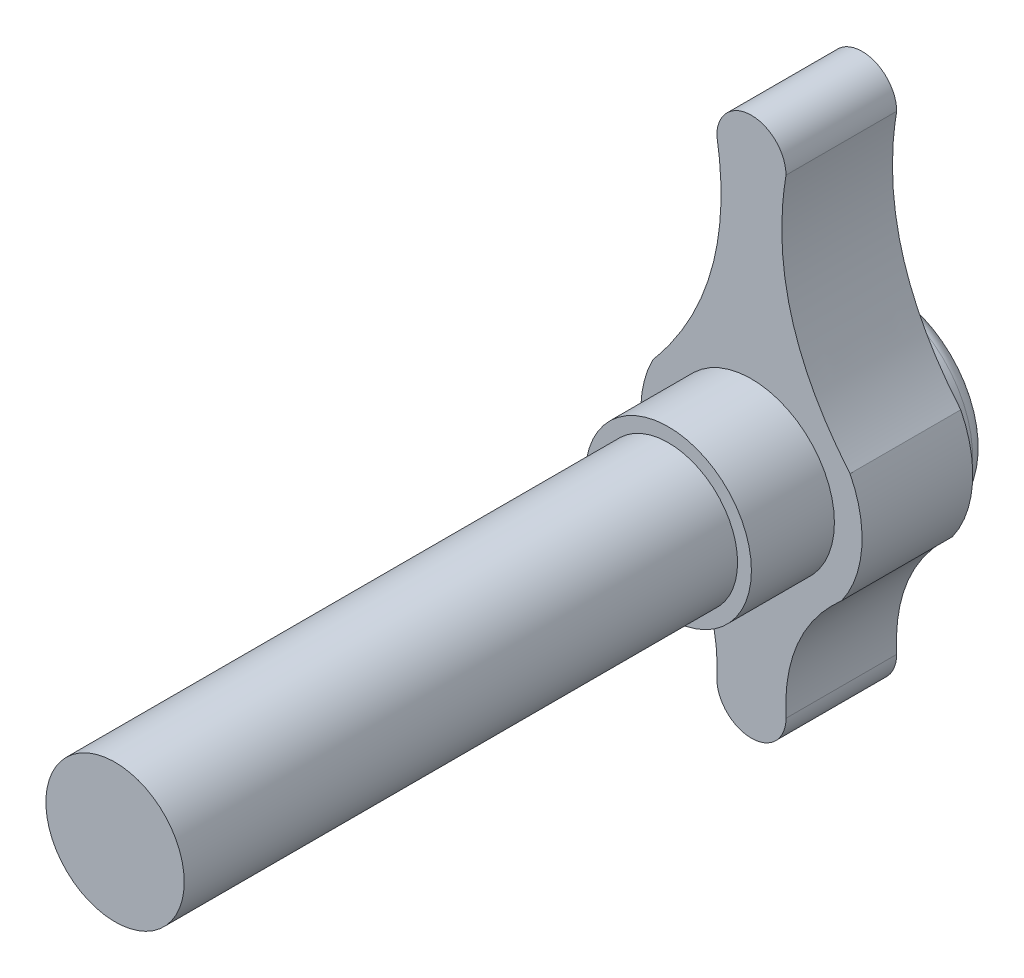
ISO-10303-21;
HEADER;
FILE_DESCRIPTION(('STEP AP214'),'2;1');
FILE_NAME('part.step','',(''),(''),'','','');
FILE_SCHEMA(('AUTOMOTIVE_DESIGN { 1 0 10303 214 1 1 1 1 }'));
ENDSEC;
DATA;
#1=APPLICATION_CONTEXT('core data for automotive mechanical design processes');
#2=APPLICATION_PROTOCOL_DEFINITION('international standard','automotive_design',2000,#1);
#3=PRODUCT_CONTEXT('',#1,'mechanical');
#4=PRODUCT('Part','Part','',(#3));
#5=PRODUCT_RELATED_PRODUCT_CATEGORY('part','',(#4));
#6=PRODUCT_DEFINITION_FORMATION('','',#4);
#7=PRODUCT_DEFINITION_CONTEXT('part definition',#1,'design');
#8=PRODUCT_DEFINITION('design','',#6,#7);
#9=PRODUCT_DEFINITION_SHAPE('','',#8);
#10=(LENGTH_UNIT() NAMED_UNIT(*) SI_UNIT(.MILLI.,.METRE.));
#11=(NAMED_UNIT(*) PLANE_ANGLE_UNIT() SI_UNIT($,.RADIAN.));
#12=(NAMED_UNIT(*) SI_UNIT($,.STERADIAN.) SOLID_ANGLE_UNIT());
#13=UNCERTAINTY_MEASURE_WITH_UNIT(LENGTH_MEASURE(1.E-05),#10,'distance_accuracy_value','');
#14=(GEOMETRIC_REPRESENTATION_CONTEXT(3) GLOBAL_UNCERTAINTY_ASSIGNED_CONTEXT((#13)) GLOBAL_UNIT_ASSIGNED_CONTEXT((#10,
#11,#12)) REPRESENTATION_CONTEXT('',''));
#15=CARTESIAN_POINT('',(0.,0.,0.));
#16=DIRECTION('',(0.,0.,1.));
#17=DIRECTION('',(1.,0.,0.));
#18=AXIS2_PLACEMENT_3D('',#15,#16,#17);
#19=CARTESIAN_POINT('',(-3.26481860087803,-2.31105160118956,4.));
#20=CARTESIAN_POINT('',(-1.09583451337075,-4.22812661050736,4.));
#21=CARTESIAN_POINT('',(-1.25,-7.,4.));
#22=B_SPLINE_CURVE_WITH_KNOTS('',2,(#19,#20,#21),.UNSPECIFIED.,.F.,.F.,(3,3),(0.,1.),.UNSPECIFIED.);
#23=DIRECTION('',(0.,0.,-1.));
#24=VECTOR('',#23,1.);
#25=SURFACE_OF_LINEAR_EXTRUSION('',#22,#24);
#26=CARTESIAN_POINT('',(-3.26481860087803,-2.31105160118956,0.));
#27=CARTESIAN_POINT('',(-1.09583451337075,-4.22812661050736,0.));
#28=CARTESIAN_POINT('',(-1.25,-7.,0.));
#29=B_SPLINE_CURVE_WITH_KNOTS('',2,(#26,#27,#28),.UNSPECIFIED.,.F.,.F.,(3,3),(0.,1.),.UNSPECIFIED.);
#30=CARTESIAN_POINT('',(-3.26481860087803,-2.31105160118956,0.));
#31=VERTEX_POINT('',#30);
#32=CARTESIAN_POINT('',(-1.25,-7.,0.));
#33=VERTEX_POINT('',#32);
#34=EDGE_CURVE('E196',#31,#33,#29,.T.);
#35=ORIENTED_EDGE('',*,*,#34,.T.);
#36=DIRECTION('',(0.,0.,-1.));
#37=VECTOR('',#36,1.);
#38=CARTESIAN_POINT('',(-1.25,-7.,4.));
#39=LINE('',#38,#37);
#40=CARTESIAN_POINT('',(-1.25,-7.,4.));
#41=VERTEX_POINT('',#40);
#42=EDGE_CURVE('E192',#41,#33,#39,.T.);
#43=ORIENTED_EDGE('',*,*,#42,.F.);
#44=CARTESIAN_POINT('',(-3.26481860087803,-2.31105160118956,4.));
#45=VERTEX_POINT('',#44);
#46=EDGE_CURVE('E180',#45,#41,#22,.T.);
#47=ORIENTED_EDGE('',*,*,#46,.F.);
#48=DIRECTION('',(0.,0.,-1.));
#49=VECTOR('',#48,1.);
#50=CARTESIAN_POINT('',(-3.26481860087803,-2.31105160118956,4.));
#51=LINE('',#50,#49);
#52=EDGE_CURVE('E128',#45,#31,#51,.T.);
#53=ORIENTED_EDGE('',*,*,#52,.T.);
#54=EDGE_LOOP('',(#35,#43,#47,#53));
#55=FACE_BOUND('',#54,.T.);
#56=ADVANCED_FACE('F33',(#55),#25,.F.);
#57=CARTESIAN_POINT('',(0.,-7.,4.));
#58=DIRECTION('',(0.,0.,-1.));
#59=DIRECTION('',(-1.,0.,0.));
#60=AXIS2_PLACEMENT_3D('',#57,#58,#59);
#61=CYLINDRICAL_SURFACE('',#60,1.25);
#62=CARTESIAN_POINT('',(0.,-7.,0.));
#63=DIRECTION('',(0.,0.,1.));
#64=DIRECTION('',(1.,0.,0.));
#65=AXIS2_PLACEMENT_3D('',#62,#63,#64);
#66=CIRCLE('',#65,1.25);
#67=CARTESIAN_POINT('',(1.25,-7.,0.));
#68=VERTEX_POINT('',#67);
#69=EDGE_CURVE('E403',#33,#68,#66,.T.);
#70=ORIENTED_EDGE('',*,*,#69,.T.);
#71=DIRECTION('',(0.,0.,-1.));
#72=VECTOR('',#71,1.);
#73=CARTESIAN_POINT('',(1.25,-7.,4.));
#74=LINE('',#73,#72);
#75=CARTESIAN_POINT('',(1.25,-7.,4.));
#76=VERTEX_POINT('',#75);
#77=EDGE_CURVE('E384',#76,#68,#74,.T.);
#78=ORIENTED_EDGE('',*,*,#77,.F.);
#79=CARTESIAN_POINT('',(0.,-7.,4.));
#80=DIRECTION('',(0.,0.,1.));
#81=DIRECTION('',(1.,0.,0.));
#82=AXIS2_PLACEMENT_3D('',#79,#80,#81);
#83=CIRCLE('',#82,1.25);
#84=EDGE_CURVE('E95',#41,#76,#83,.T.);
#85=ORIENTED_EDGE('',*,*,#84,.F.);
#86=ORIENTED_EDGE('',*,*,#42,.T.);
#87=EDGE_LOOP('',(#70,#78,#85,#86));
#88=FACE_BOUND('',#87,.T.);
#89=ADVANCED_FACE('F173',(#88),#61,.T.);
#90=CARTESIAN_POINT('',(1.25,-7.,4.));
#91=CARTESIAN_POINT('',(1.09583451337075,-4.22812661050736,4.));
#92=CARTESIAN_POINT('',(3.26481860087803,-2.31105160118956,4.));
#93=B_SPLINE_CURVE_WITH_KNOTS('',2,(#90,#91,#92),.UNSPECIFIED.,.F.,.F.,(3,3),(0.,1.),.UNSPECIFIED.);
#94=DIRECTION('',(0.,0.,-1.));
#95=VECTOR('',#94,1.);
#96=SURFACE_OF_LINEAR_EXTRUSION('',#93,#95);
#97=CARTESIAN_POINT('',(1.25,-7.,0.));
#98=CARTESIAN_POINT('',(1.09583451337075,-4.22812661050736,0.));
#99=CARTESIAN_POINT('',(3.26481860087803,-2.31105160118956,0.));
#100=B_SPLINE_CURVE_WITH_KNOTS('',2,(#97,#98,#99),.UNSPECIFIED.,.F.,.F.,(3,3),(0.,1.),.UNSPECIFIED.);
#101=CARTESIAN_POINT('',(3.26481860087803,-2.31105160118957,0.));
#102=VERTEX_POINT('',#101);
#103=EDGE_CURVE('E360',#68,#102,#100,.T.);
#104=ORIENTED_EDGE('',*,*,#103,.T.);
#105=DIRECTION('',(0.,0.,-1.));
#106=VECTOR('',#105,1.);
#107=CARTESIAN_POINT('',(3.26481860087803,-2.31105160118957,4.));
#108=LINE('',#107,#106);
#109=CARTESIAN_POINT('',(3.26481860087803,-2.31105160118957,4.));
#110=VERTEX_POINT('',#109);
#111=EDGE_CURVE('E355',#110,#102,#108,.T.);
#112=ORIENTED_EDGE('',*,*,#111,.F.);
#113=EDGE_CURVE('E161',#76,#110,#93,.T.);
#114=ORIENTED_EDGE('',*,*,#113,.F.);
#115=ORIENTED_EDGE('',*,*,#77,.T.);
#116=EDGE_LOOP('',(#104,#112,#114,#115));
#117=FACE_BOUND('',#116,.T.);
#118=ADVANCED_FACE('F170',(#117),#96,.F.);
#119=CARTESIAN_POINT('',(0.,0.,4.));
#120=DIRECTION('',(0.,0.,-1.));
#121=DIRECTION('',(-1.,0.,0.));
#122=AXIS2_PLACEMENT_3D('',#119,#120,#121);
#123=CYLINDRICAL_SURFACE('',#122,4.);
#124=CARTESIAN_POINT('',(0.,0.,0.));
#125=DIRECTION('',(0.,0.,1.));
#126=DIRECTION('',(1.,0.,0.));
#127=AXIS2_PLACEMENT_3D('',#124,#125,#126);
#128=CIRCLE('',#127,4.);
#129=CARTESIAN_POINT('',(3.56449893053864,1.8150337115847,0.));
#130=VERTEX_POINT('',#129);
#131=EDGE_CURVE('E350',#102,#130,#128,.T.);
#132=ORIENTED_EDGE('',*,*,#131,.T.);
#133=DIRECTION('',(0.,0.,-1.));
#134=VECTOR('',#133,1.);
#135=CARTESIAN_POINT('',(3.56449893053864,1.8150337115847,4.));
#136=LINE('',#135,#134);
#137=CARTESIAN_POINT('',(3.56449893053864,1.8150337115847,4.));
#138=VERTEX_POINT('',#137);
#139=EDGE_CURVE('E353',#138,#130,#136,.T.);
#140=ORIENTED_EDGE('',*,*,#139,.F.);
#141=CARTESIAN_POINT('',(0.,0.,4.));
#142=DIRECTION('',(0.,0.,1.));
#143=DIRECTION('',(1.,0.,0.));
#144=AXIS2_PLACEMENT_3D('',#141,#142,#143);
#145=CIRCLE('',#144,4.);
#146=EDGE_CURVE('E156',#110,#138,#145,.T.);
#147=ORIENTED_EDGE('',*,*,#146,.F.);
#148=ORIENTED_EDGE('',*,*,#111,.T.);
#149=EDGE_LOOP('',(#132,#140,#147,#148));
#150=FACE_BOUND('',#149,.T.);
#151=ADVANCED_FACE('F149',(#150),#123,.T.);
#152=CARTESIAN_POINT('',(3.56449893053864,1.8150337115847,4.));
#153=CARTESIAN_POINT('',(0.483839944329664,5.46049333109178,4.));
#154=CARTESIAN_POINT('',(1.25,10.,4.));
#155=B_SPLINE_CURVE_WITH_KNOTS('',2,(#152,#153,#154),.UNSPECIFIED.,.F.,.F.,(3,3),(0.,1.),.UNSPECIFIED.);
#156=DIRECTION('',(0.,0.,-1.));
#157=VECTOR('',#156,1.);
#158=SURFACE_OF_LINEAR_EXTRUSION('',#155,#157);
#159=CARTESIAN_POINT('',(3.56449893053864,1.8150337115847,0.));
#160=CARTESIAN_POINT('',(0.483839944329664,5.46049333109178,0.));
#161=CARTESIAN_POINT('',(1.25,10.,0.));
#162=B_SPLINE_CURVE_WITH_KNOTS('',2,(#159,#160,#161),.UNSPECIFIED.,.F.,.F.,(3,3),(0.,1.),.UNSPECIFIED.);
#163=CARTESIAN_POINT('',(1.25,10.,0.));
#164=VERTEX_POINT('',#163);
#165=EDGE_CURVE('E359',#130,#164,#162,.T.);
#166=ORIENTED_EDGE('',*,*,#165,.T.);
#167=DIRECTION('',(0.,0.,-1.));
#168=VECTOR('',#167,1.);
#169=CARTESIAN_POINT('',(1.25,10.,4.));
#170=LINE('',#169,#168);
#171=CARTESIAN_POINT('',(1.25,10.,4.));
#172=VERTEX_POINT('',#171);
#173=EDGE_CURVE('E123',#172,#164,#170,.T.);
#174=ORIENTED_EDGE('',*,*,#173,.F.);
#175=EDGE_CURVE('E114',#138,#172,#155,.T.);
#176=ORIENTED_EDGE('',*,*,#175,.F.);
#177=ORIENTED_EDGE('',*,*,#139,.T.);
#178=EDGE_LOOP('',(#166,#174,#176,#177));
#179=FACE_BOUND('',#178,.T.);
#180=ADVANCED_FACE('F146',(#179),#158,.F.);
#181=CARTESIAN_POINT('',(0.,10.,4.));
#182=DIRECTION('',(0.,0.,-1.));
#183=DIRECTION('',(-1.,0.,0.));
#184=AXIS2_PLACEMENT_3D('',#181,#182,#183);
#185=CYLINDRICAL_SURFACE('',#184,1.25);
#186=CARTESIAN_POINT('',(0.,10.,0.));
#187=DIRECTION('',(0.,0.,1.));
#188=DIRECTION('',(1.,0.,0.));
#189=AXIS2_PLACEMENT_3D('',#186,#187,#188);
#190=CIRCLE('',#189,1.25);
#191=CARTESIAN_POINT('',(-1.25,10.,0.));
#192=VERTEX_POINT('',#191);
#193=EDGE_CURVE('E122',#164,#192,#190,.T.);
#194=ORIENTED_EDGE('',*,*,#193,.T.);
#195=DIRECTION('',(0.,0.,-1.));
#196=VECTOR('',#195,1.);
#197=CARTESIAN_POINT('',(-1.25,10.,4.));
#198=LINE('',#197,#196);
#199=CARTESIAN_POINT('',(-1.25,10.,4.));
#200=VERTEX_POINT('',#199);
#201=EDGE_CURVE('E119',#200,#192,#198,.T.);
#202=ORIENTED_EDGE('',*,*,#201,.F.);
#203=CARTESIAN_POINT('',(0.,10.,4.));
#204=DIRECTION('',(0.,0.,1.));
#205=DIRECTION('',(1.,0.,0.));
#206=AXIS2_PLACEMENT_3D('',#203,#204,#205);
#207=CIRCLE('',#206,1.25);
#208=EDGE_CURVE('E108',#172,#200,#207,.T.);
#209=ORIENTED_EDGE('',*,*,#208,.F.);
#210=ORIENTED_EDGE('',*,*,#173,.T.);
#211=EDGE_LOOP('',(#194,#202,#209,#210));
#212=FACE_BOUND('',#211,.T.);
#213=ADVANCED_FACE('F120',(#212),#185,.T.);
#214=CARTESIAN_POINT('',(-1.25,10.,4.));
#215=CARTESIAN_POINT('',(-0.483839944329664,5.46049333109178,4.));
#216=CARTESIAN_POINT('',(-3.56449893053864,1.8150337115847,4.));
#217=B_SPLINE_CURVE_WITH_KNOTS('',2,(#214,#215,#216),.UNSPECIFIED.,.F.,.F.,(3,3),(0.,1.),.UNSPECIFIED.);
#218=DIRECTION('',(0.,0.,-1.));
#219=VECTOR('',#218,1.);
#220=SURFACE_OF_LINEAR_EXTRUSION('',#217,#219);
#221=CARTESIAN_POINT('',(-1.25,10.,0.));
#222=CARTESIAN_POINT('',(-0.483839944329664,5.46049333109178,0.));
#223=CARTESIAN_POINT('',(-3.56449893053864,1.8150337115847,0.));
#224=B_SPLINE_CURVE_WITH_KNOTS('',2,(#221,#222,#223),.UNSPECIFIED.,.F.,.F.,(3,3),(0.,1.),.UNSPECIFIED.);
#225=CARTESIAN_POINT('',(-3.56449893053864,1.8150337115847,0.));
#226=VERTEX_POINT('',#225);
#227=EDGE_CURVE('E80',#192,#226,#224,.T.);
#228=ORIENTED_EDGE('',*,*,#227,.T.);
#229=DIRECTION('',(0.,0.,-1.));
#230=VECTOR('',#229,1.);
#231=CARTESIAN_POINT('',(-3.56449893053864,1.8150337115847,4.));
#232=LINE('',#231,#230);
#233=CARTESIAN_POINT('',(-3.56449893053864,1.8150337115847,4.));
#234=VERTEX_POINT('',#233);
#235=EDGE_CURVE('E124',#234,#226,#232,.T.);
#236=ORIENTED_EDGE('',*,*,#235,.F.);
#237=EDGE_CURVE('E112',#200,#234,#217,.T.);
#238=ORIENTED_EDGE('',*,*,#237,.F.);
#239=ORIENTED_EDGE('',*,*,#201,.T.);
#240=EDGE_LOOP('',(#228,#236,#238,#239));
#241=FACE_BOUND('',#240,.T.);
#242=ADVANCED_FACE('F126',(#241),#220,.F.);
#243=CARTESIAN_POINT('',(0.,0.,4.));
#244=DIRECTION('',(0.,0.,-1.));
#245=DIRECTION('',(-1.,0.,0.));
#246=AXIS2_PLACEMENT_3D('',#243,#244,#245);
#247=CYLINDRICAL_SURFACE('',#246,4.);
#248=CARTESIAN_POINT('',(0.,0.,0.));
#249=DIRECTION('',(0.,0.,1.));
#250=DIRECTION('',(1.,0.,0.));
#251=AXIS2_PLACEMENT_3D('',#248,#249,#250);
#252=CIRCLE('',#251,4.);
#253=EDGE_CURVE('E86',#226,#31,#252,.T.);
#254=ORIENTED_EDGE('',*,*,#253,.T.);
#255=ORIENTED_EDGE('',*,*,#52,.F.);
#256=CARTESIAN_POINT('',(0.,0.,4.));
#257=DIRECTION('',(0.,0.,1.));
#258=DIRECTION('',(1.,0.,0.));
#259=AXIS2_PLACEMENT_3D('',#256,#257,#258);
#260=CIRCLE('',#259,4.);
#261=EDGE_CURVE('E51',#234,#45,#260,.T.);
#262=ORIENTED_EDGE('',*,*,#261,.F.);
#263=ORIENTED_EDGE('',*,*,#235,.T.);
#264=EDGE_LOOP('',(#254,#255,#262,#263));
#265=FACE_BOUND('',#264,.T.);
#266=ADVANCED_FACE('F142',(#265),#247,.T.);
#267=CARTESIAN_POINT('',(-1.67662190690488,-4.44182620555107,4.));
#268=DIRECTION('',(0.,0.,1.));
#269=DIRECTION('',(1.,0.,0.));
#270=AXIS2_PLACEMENT_3D('',#267,#268,#269);
#271=PLANE('',#270);
#272=CARTESIAN_POINT('',(0.,0.,4.));
#273=DIRECTION('',(0.,0.,1.));
#274=DIRECTION('',(1.,0.,0.));
#275=AXIS2_PLACEMENT_3D('',#272,#273,#274);
#276=CIRCLE('',#275,3.);
#277=CARTESIAN_POINT('',(3.,0.,4.));
#278=VERTEX_POINT('',#277);
#279=EDGE_CURVE('E198',#278,#278,#276,.T.);
#280=ORIENTED_EDGE('',*,*,#279,.F.);
#281=EDGE_LOOP('',(#280));
#282=FACE_BOUND('',#281,.T.);
#283=ORIENTED_EDGE('',*,*,#46,.T.);
#284=ORIENTED_EDGE('',*,*,#84,.T.);
#285=ORIENTED_EDGE('',*,*,#113,.T.);
#286=ORIENTED_EDGE('',*,*,#146,.T.);
#287=ORIENTED_EDGE('',*,*,#175,.T.);
#288=ORIENTED_EDGE('',*,*,#208,.T.);
#289=ORIENTED_EDGE('',*,*,#237,.T.);
#290=ORIENTED_EDGE('',*,*,#261,.T.);
#291=EDGE_LOOP('',(#283,#284,#285,#286,#287,#288,#289,#290));
#292=FACE_BOUND('',#291,.T.);
#293=ADVANCED_FACE('F110',(#282,#292),#271,.T.);
#294=CARTESIAN_POINT('',(-1.67662190690488,-4.44182620555107,0.));
#295=DIRECTION('',(0.,0.,1.));
#296=DIRECTION('',(1.,0.,0.));
#297=AXIS2_PLACEMENT_3D('',#294,#295,#296);
#298=PLANE('',#297);
#299=CARTESIAN_POINT('',(0.,0.0981974791598768,0.));
#300=DIRECTION('',(0.,0.,-1.));
#301=DIRECTION('',(-1.,0.,0.));
#302=AXIS2_PLACEMENT_3D('',#299,#300,#301);
#303=CIRCLE('',#302,3.48970951115964);
#304=CARTESIAN_POINT('',(-3.48970951115964,0.0981974791598768,0.));
#305=VERTEX_POINT('',#304);
#306=EDGE_CURVE('E185',#305,#305,#303,.T.);
#307=ORIENTED_EDGE('',*,*,#306,.F.);
#308=EDGE_LOOP('',(#307));
#309=FACE_BOUND('',#308,.T.);
#310=ORIENTED_EDGE('',*,*,#34,.F.);
#311=ORIENTED_EDGE('',*,*,#253,.F.);
#312=ORIENTED_EDGE('',*,*,#227,.F.);
#313=ORIENTED_EDGE('',*,*,#193,.F.);
#314=ORIENTED_EDGE('',*,*,#165,.F.);
#315=ORIENTED_EDGE('',*,*,#131,.F.);
#316=ORIENTED_EDGE('',*,*,#103,.F.);
#317=ORIENTED_EDGE('',*,*,#69,.F.);
#318=EDGE_LOOP('',(#310,#311,#312,#313,#314,#315,#316,#317));
#319=FACE_BOUND('',#318,.T.);
#320=ADVANCED_FACE('F228',(#309,#319),#298,.F.);
#321=CARTESIAN_POINT('',(0.,0.0981974791598768,-1.));
#322=DIRECTION('',(0.,0.,1.));
#323=DIRECTION('',(1.,0.,0.));
#324=AXIS2_PLACEMENT_3D('',#321,#322,#323);
#325=CYLINDRICAL_SURFACE('',#324,3.48970951115964);
#326=CARTESIAN_POINT('',(0.,0.0981974791598768,-0.5));
#327=DIRECTION('',(0.,0.,-1.));
#328=DIRECTION('',(-1.,0.,0.));
#329=AXIS2_PLACEMENT_3D('',#326,#327,#328);
#330=CIRCLE('',#329,3.48970951115964);
#331=CARTESIAN_POINT('',(-3.48970951115964,0.0981974791598768,-0.5));
#332=VERTEX_POINT('',#331);
#333=EDGE_CURVE('E37',#332,#332,#330,.F.);
#334=ORIENTED_EDGE('',*,*,#333,.T.);
#335=EDGE_LOOP('',(#334));
#336=FACE_BOUND('',#335,.T.);
#337=ORIENTED_EDGE('',*,*,#306,.T.);
#338=EDGE_LOOP('',(#337));
#339=FACE_BOUND('',#338,.T.);
#340=ADVANCED_FACE('F234',(#336,#339),#325,.T.);
#341=CARTESIAN_POINT('',(0.,0.0981974791598768,-1.));
#342=DIRECTION('',(0.,0.,-1.));
#343=DIRECTION('',(-1.,0.,0.));
#344=AXIS2_PLACEMENT_3D('',#341,#342,#343);
#345=PLANE('',#344);
#346=CARTESIAN_POINT('',(0.,0.0981974791598768,-1.));
#347=DIRECTION('',(0.,0.,-1.));
#348=DIRECTION('',(-1.,0.,0.));
#349=AXIS2_PLACEMENT_3D('',#346,#347,#348);
#350=CIRCLE('',#349,2.98970951115964);
#351=CARTESIAN_POINT('',(-2.98970951115964,0.0981974791598768,-1.));
#352=VERTEX_POINT('',#351);
#353=EDGE_CURVE('E389',#352,#352,#350,.T.);
#354=ORIENTED_EDGE('',*,*,#353,.T.);
#355=EDGE_LOOP('',(#354));
#356=FACE_BOUND('',#355,.T.);
#357=CARTESIAN_POINT('',(0.,0.,-1.));
#358=DIRECTION('',(0.,0.,-1.));
#359=DIRECTION('',(-1.,0.,0.));
#360=AXIS2_PLACEMENT_3D('',#357,#358,#359);
#361=CIRCLE('',#360,2.15109798270577);
#362=CARTESIAN_POINT('',(-2.15109798270577,0.,-1.));
#363=VERTEX_POINT('',#362);
#364=EDGE_CURVE('E193',#363,#363,#361,.T.);
#365=ORIENTED_EDGE('',*,*,#364,.F.);
#366=EDGE_LOOP('',(#365));
#367=FACE_BOUND('',#366,.T.);
#368=ADVANCED_FACE('F239',(#356,#367),#345,.T.);
#369=CARTESIAN_POINT('',(0.,0.,-0.5));
#370=DIRECTION('',(0.,0.,-1.));
#371=DIRECTION('',(-1.,0.,0.));
#372=AXIS2_PLACEMENT_3D('',#369,#370,#371);
#373=PLANE('',#372);
#374=CARTESIAN_POINT('',(0.,0.,-0.5));
#375=DIRECTION('',(0.,0.,-1.));
#376=DIRECTION('',(-1.,0.,0.));
#377=AXIS2_PLACEMENT_3D('',#374,#375,#376);
#378=CIRCLE('',#377,1.65109798270577);
#379=CARTESIAN_POINT('',(-1.65109798270577,0.,-0.5));
#380=VERTEX_POINT('',#379);
#381=EDGE_CURVE('E191',#380,#380,#378,.T.);
#382=ORIENTED_EDGE('',*,*,#381,.T.);
#383=EDGE_LOOP('',(#382));
#384=FACE_BOUND('',#383,.T.);
#385=ADVANCED_FACE('F243',(#384),#373,.T.);
#386=CARTESIAN_POINT('',(0.,0.,-1.));
#387=DIRECTION('',(0.,0.,-1.));
#388=DIRECTION('',(-1.,0.,0.));
#389=AXIS2_PLACEMENT_3D('',#386,#387,#388);
#390=TOROIDAL_SURFACE('',#389,1.65109798270577,0.5);
#391=ORIENTED_EDGE('',*,*,#364,.T.);
#392=EDGE_LOOP('',(#391));
#393=FACE_BOUND('',#392,.T.);
#394=ORIENTED_EDGE('',*,*,#381,.F.);
#395=EDGE_LOOP('',(#394));
#396=FACE_BOUND('',#395,.T.);
#397=ADVANCED_FACE('F179',(#393,#396),#390,.F.);
#398=CARTESIAN_POINT('',(0.,0.0981974791598768,-0.5));
#399=DIRECTION('',(0.,0.,-1.));
#400=DIRECTION('',(-1.,0.,0.));
#401=AXIS2_PLACEMENT_3D('',#398,#399,#400);
#402=TOROIDAL_SURFACE('',#401,2.98970951115964,0.5);
#403=ORIENTED_EDGE('',*,*,#333,.F.);
#404=EDGE_LOOP('',(#403));
#405=FACE_BOUND('',#404,.T.);
#406=ORIENTED_EDGE('',*,*,#353,.F.);
#407=EDGE_LOOP('',(#406));
#408=FACE_BOUND('',#407,.T.);
#409=ADVANCED_FACE('F35',(#405,#408),#402,.T.);
#410=CARTESIAN_POINT('',(0.,0.,7.));
#411=DIRECTION('',(0.,0.,-1.));
#412=DIRECTION('',(-1.,0.,0.));
#413=AXIS2_PLACEMENT_3D('',#410,#411,#412);
#414=CYLINDRICAL_SURFACE('',#413,3.);
#415=CARTESIAN_POINT('',(0.,0.,7.));
#416=DIRECTION('',(0.,0.,1.));
#417=DIRECTION('',(1.,0.,0.));
#418=AXIS2_PLACEMENT_3D('',#415,#416,#417);
#419=CIRCLE('',#418,3.);
#420=CARTESIAN_POINT('',(3.,0.,7.));
#421=VERTEX_POINT('',#420);
#422=EDGE_CURVE('E197',#421,#421,#419,.T.);
#423=ORIENTED_EDGE('',*,*,#422,.F.);
#424=EDGE_LOOP('',(#423));
#425=FACE_BOUND('',#424,.T.);
#426=ORIENTED_EDGE('',*,*,#279,.T.);
#427=EDGE_LOOP('',(#426));
#428=FACE_BOUND('',#427,.T.);
#429=ADVANCED_FACE('F218',(#425,#428),#414,.T.);
#430=CARTESIAN_POINT('',(0.,0.,7.));
#431=DIRECTION('',(0.,0.,1.));
#432=DIRECTION('',(1.,0.,0.));
#433=AXIS2_PLACEMENT_3D('',#430,#431,#432);
#434=PLANE('',#433);
#435=CARTESIAN_POINT('',(0.,0.,7.));
#436=DIRECTION('',(0.,0.,1.));
#437=DIRECTION('',(1.,0.,0.));
#438=AXIS2_PLACEMENT_3D('',#435,#436,#437);
#439=CIRCLE('',#438,2.5);
#440=CARTESIAN_POINT('',(2.5,0.,7.));
#441=VERTEX_POINT('',#440);
#442=EDGE_CURVE('E11',#441,#441,#439,.T.);
#443=ORIENTED_EDGE('',*,*,#442,.F.);
#444=EDGE_LOOP('',(#443));
#445=FACE_BOUND('',#444,.T.);
#446=ORIENTED_EDGE('',*,*,#422,.T.);
#447=EDGE_LOOP('',(#446));
#448=FACE_BOUND('',#447,.T.);
#449=ADVANCED_FACE('F212',(#445,#448),#434,.T.);
#450=CARTESIAN_POINT('',(0.,0.,27.));
#451=DIRECTION('',(0.,0.,-1.));
#452=DIRECTION('',(-1.,0.,0.));
#453=AXIS2_PLACEMENT_3D('',#450,#451,#452);
#454=CYLINDRICAL_SURFACE('',#453,2.5);
#455=CARTESIAN_POINT('',(0.,0.,27.));
#456=DIRECTION('',(0.,0.,1.));
#457=DIRECTION('',(1.,0.,0.));
#458=AXIS2_PLACEMENT_3D('',#455,#456,#457);
#459=CIRCLE('',#458,2.5);
#460=CARTESIAN_POINT('',(2.5,0.,27.));
#461=VERTEX_POINT('',#460);
#462=EDGE_CURVE('E201',#461,#461,#459,.T.);
#463=ORIENTED_EDGE('',*,*,#462,.F.);
#464=EDGE_LOOP('',(#463));
#465=FACE_BOUND('',#464,.T.);
#466=ORIENTED_EDGE('',*,*,#442,.T.);
#467=EDGE_LOOP('',(#466));
#468=FACE_BOUND('',#467,.T.);
#469=ADVANCED_FACE('F209',(#465,#468),#454,.T.);
#470=CARTESIAN_POINT('',(0.,0.,27.));
#471=DIRECTION('',(0.,0.,1.));
#472=DIRECTION('',(1.,0.,0.));
#473=AXIS2_PLACEMENT_3D('',#470,#471,#472);
#474=PLANE('',#473);
#475=ORIENTED_EDGE('',*,*,#462,.T.);
#476=EDGE_LOOP('',(#475));
#477=FACE_BOUND('',#476,.T.);
#478=ADVANCED_FACE('F207',(#477),#474,.T.);
#479=CLOSED_SHELL('',(#56,#89,#118,#151,#180,#213,#242,#266,#293,#320,#340,#368,#385,#397,#409,
#429,#449,#469,#478));
#480=MANIFOLD_SOLID_BREP('B2',#479);
#481=ADVANCED_BREP_SHAPE_REPRESENTATION('',(#18,#480),#14);
#482=SHAPE_DEFINITION_REPRESENTATION(#9,#481);
ENDSEC;
END-ISO-10303-21;
